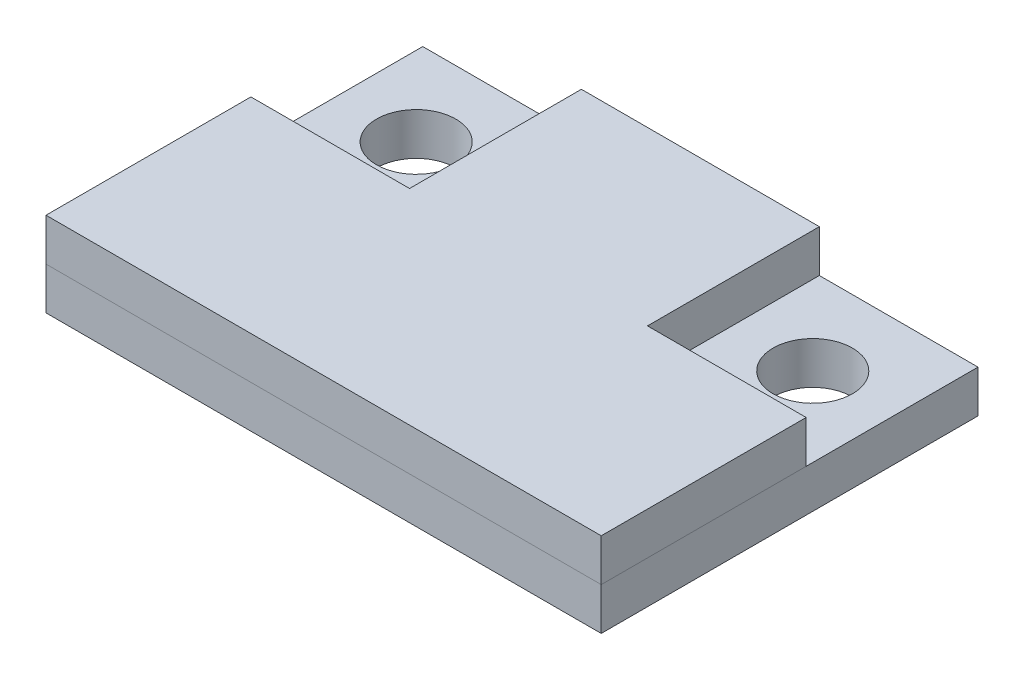
ISO-10303-21;
HEADER;
FILE_DESCRIPTION(('STEP AP214'),'2;1');
FILE_NAME('part.step','',(''),(''),'','','');
FILE_SCHEMA(('AUTOMOTIVE_DESIGN { 1 0 10303 214 1 1 1 1 }'));
ENDSEC;
DATA;
#1=APPLICATION_CONTEXT('core data for automotive mechanical design processes');
#2=APPLICATION_PROTOCOL_DEFINITION('international standard','automotive_design',2000,#1);
#3=PRODUCT_CONTEXT('',#1,'mechanical');
#4=PRODUCT('Part','Part','',(#3));
#5=PRODUCT_RELATED_PRODUCT_CATEGORY('part','',(#4));
#6=PRODUCT_DEFINITION_FORMATION('','',#4);
#7=PRODUCT_DEFINITION_CONTEXT('part definition',#1,'design');
#8=PRODUCT_DEFINITION('design','',#6,#7);
#9=PRODUCT_DEFINITION_SHAPE('','',#8);
#10=(LENGTH_UNIT() NAMED_UNIT(*) SI_UNIT(.MILLI.,.METRE.));
#11=(NAMED_UNIT(*) PLANE_ANGLE_UNIT() SI_UNIT($,.RADIAN.));
#12=(NAMED_UNIT(*) SI_UNIT($,.STERADIAN.) SOLID_ANGLE_UNIT());
#13=UNCERTAINTY_MEASURE_WITH_UNIT(LENGTH_MEASURE(1.E-05),#10,'distance_accuracy_value','');
#14=(GEOMETRIC_REPRESENTATION_CONTEXT(3) GLOBAL_UNCERTAINTY_ASSIGNED_CONTEXT((#13)) GLOBAL_UNIT_ASSIGNED_CONTEXT((#10,
#11,#12)) REPRESENTATION_CONTEXT('',''));
#15=CARTESIAN_POINT('',(0.,0.,0.));
#16=DIRECTION('',(0.,0.,1.));
#17=DIRECTION('',(1.,0.,0.));
#18=AXIS2_PLACEMENT_3D('',#15,#16,#17);
#19=CARTESIAN_POINT('',(-4.5,1.6,-7.125));
#20=DIRECTION('',(1.,0.,0.));
#21=DIRECTION('',(0.,0.,-1.));
#22=AXIS2_PLACEMENT_3D('',#19,#20,#21);
#23=PLANE('',#22);
#24=DIRECTION('',(0.,0.,1.));
#25=VECTOR('',#24,1.);
#26=CARTESIAN_POINT('',(-4.5,0.,-7.125));
#27=LINE('',#26,#25);
#28=CARTESIAN_POINT('',(-4.5,0.,-7.125));
#29=VERTEX_POINT('',#28);
#30=CARTESIAN_POINT('',(-4.5,0.,-0.624999999999993));
#31=VERTEX_POINT('',#30);
#32=EDGE_CURVE('E147',#29,#31,#27,.T.);
#33=ORIENTED_EDGE('',*,*,#32,.T.);
#34=DIRECTION('',(0.,-1.,0.));
#35=VECTOR('',#34,1.);
#36=CARTESIAN_POINT('',(-4.5,1.6,-0.624999999999993));
#37=LINE('',#36,#35);
#38=CARTESIAN_POINT('',(-4.5,1.6,-0.624999999999993));
#39=VERTEX_POINT('',#38);
#40=EDGE_CURVE('E12',#39,#31,#37,.T.);
#41=ORIENTED_EDGE('',*,*,#40,.F.);
#42=DIRECTION('',(0.,0.,1.));
#43=VECTOR('',#42,1.);
#44=CARTESIAN_POINT('',(-4.5,1.6,-7.125));
#45=LINE('',#44,#43);
#46=CARTESIAN_POINT('',(-4.5,1.6,-7.125));
#47=VERTEX_POINT('',#46);
#48=EDGE_CURVE('E161',#47,#39,#45,.T.);
#49=ORIENTED_EDGE('',*,*,#48,.F.);
#50=DIRECTION('',(0.,-1.,0.));
#51=VECTOR('',#50,1.);
#52=CARTESIAN_POINT('',(-4.5,1.6,-7.125));
#53=LINE('',#52,#51);
#54=EDGE_CURVE('E143',#47,#29,#53,.T.);
#55=ORIENTED_EDGE('',*,*,#54,.T.);
#56=EDGE_LOOP('',(#33,#41,#49,#55));
#57=FACE_BOUND('',#56,.T.);
#58=ADVANCED_FACE('F51',(#57),#23,.F.);
#59=CARTESIAN_POINT('',(-10.5,1.6,-0.624999999999993));
#60=DIRECTION('',(0.,0.,1.));
#61=DIRECTION('',(1.,0.,0.));
#62=AXIS2_PLACEMENT_3D('',#59,#60,#61);
#63=PLANE('',#62);
#64=DIRECTION('',(-1.,0.,0.));
#65=VECTOR('',#64,1.);
#66=CARTESIAN_POINT('',(-10.5,0.,-0.624999999999993));
#67=LINE('',#66,#65);
#68=CARTESIAN_POINT('',(-10.5,0.,-0.624999999999993));
#69=VERTEX_POINT('',#68);
#70=EDGE_CURVE('E150',#31,#69,#67,.T.);
#71=ORIENTED_EDGE('',*,*,#70,.T.);
#72=DIRECTION('',(0.,-1.,0.));
#73=VECTOR('',#72,1.);
#74=CARTESIAN_POINT('',(-10.5,1.6,-0.624999999999993));
#75=LINE('',#74,#73);
#76=CARTESIAN_POINT('',(-10.5,1.6,-0.624999999999993));
#77=VERTEX_POINT('',#76);
#78=EDGE_CURVE('E59',#77,#69,#75,.T.);
#79=ORIENTED_EDGE('',*,*,#78,.F.);
#80=DIRECTION('',(-1.,0.,0.));
#81=VECTOR('',#80,1.);
#82=CARTESIAN_POINT('',(-10.5,1.6,-0.624999999999993));
#83=LINE('',#82,#81);
#84=EDGE_CURVE('E110',#39,#77,#83,.T.);
#85=ORIENTED_EDGE('',*,*,#84,.F.);
#86=ORIENTED_EDGE('',*,*,#40,.T.);
#87=EDGE_LOOP('',(#71,#79,#85,#86));
#88=FACE_BOUND('',#87,.T.);
#89=ADVANCED_FACE('F196',(#88),#63,.F.);
#90=CARTESIAN_POINT('',(-10.5,1.6,-0.624999999999993));
#91=DIRECTION('',(1.,0.,0.));
#92=DIRECTION('',(0.,0.,-1.));
#93=AXIS2_PLACEMENT_3D('',#90,#91,#92);
#94=PLANE('',#93);
#95=DIRECTION('',(0.,0.,1.));
#96=VECTOR('',#95,1.);
#97=CARTESIAN_POINT('',(-10.5,0.,-0.624999999999993));
#98=LINE('',#97,#96);
#99=CARTESIAN_POINT('',(-10.5,0.,7.125));
#100=VERTEX_POINT('',#99);
#101=EDGE_CURVE('E152',#69,#100,#98,.T.);
#102=ORIENTED_EDGE('',*,*,#101,.T.);
#103=DIRECTION('',(0.,-1.,0.));
#104=VECTOR('',#103,1.);
#105=CARTESIAN_POINT('',(-10.5,1.6,7.125));
#106=LINE('',#105,#104);
#107=CARTESIAN_POINT('',(-10.5,1.6,7.125));
#108=VERTEX_POINT('',#107);
#109=EDGE_CURVE('E168',#108,#100,#106,.T.);
#110=ORIENTED_EDGE('',*,*,#109,.F.);
#111=DIRECTION('',(0.,0.,1.));
#112=VECTOR('',#111,1.);
#113=CARTESIAN_POINT('',(-10.5,1.6,-0.624999999999993));
#114=LINE('',#113,#112);
#115=EDGE_CURVE('E176',#77,#108,#114,.T.);
#116=ORIENTED_EDGE('',*,*,#115,.F.);
#117=ORIENTED_EDGE('',*,*,#78,.T.);
#118=EDGE_LOOP('',(#102,#110,#116,#117));
#119=FACE_BOUND('',#118,.T.);
#120=ADVANCED_FACE('F174',(#119),#94,.F.);
#121=CARTESIAN_POINT('',(-10.5,1.6,7.125));
#122=DIRECTION('',(0.,0.,-1.));
#123=DIRECTION('',(-1.,0.,0.));
#124=AXIS2_PLACEMENT_3D('',#121,#122,#123);
#125=PLANE('',#124);
#126=DIRECTION('',(1.,0.,0.));
#127=VECTOR('',#126,1.);
#128=CARTESIAN_POINT('',(-10.5,0.,7.125));
#129=LINE('',#128,#127);
#130=CARTESIAN_POINT('',(10.5,0.,7.125));
#131=VERTEX_POINT('',#130);
#132=EDGE_CURVE('E154',#100,#131,#129,.T.);
#133=ORIENTED_EDGE('',*,*,#132,.T.);
#134=DIRECTION('',(0.,-1.,0.));
#135=VECTOR('',#134,1.);
#136=CARTESIAN_POINT('',(10.5,1.6,7.125));
#137=LINE('',#136,#135);
#138=CARTESIAN_POINT('',(10.5,1.6,7.125));
#139=VERTEX_POINT('',#138);
#140=EDGE_CURVE('E165',#139,#131,#137,.T.);
#141=ORIENTED_EDGE('',*,*,#140,.F.);
#142=DIRECTION('',(1.,0.,0.));
#143=VECTOR('',#142,1.);
#144=CARTESIAN_POINT('',(-10.5,1.6,7.125));
#145=LINE('',#144,#143);
#146=EDGE_CURVE('E188',#108,#139,#145,.T.);
#147=ORIENTED_EDGE('',*,*,#146,.F.);
#148=ORIENTED_EDGE('',*,*,#109,.T.);
#149=EDGE_LOOP('',(#133,#141,#147,#148));
#150=FACE_BOUND('',#149,.T.);
#151=ADVANCED_FACE('F184',(#150),#125,.F.);
#152=CARTESIAN_POINT('',(10.5,1.6,7.125));
#153=DIRECTION('',(-1.,0.,0.));
#154=DIRECTION('',(0.,0.,1.));
#155=AXIS2_PLACEMENT_3D('',#152,#153,#154);
#156=PLANE('',#155);
#157=DIRECTION('',(0.,0.,-1.));
#158=VECTOR('',#157,1.);
#159=CARTESIAN_POINT('',(10.5,0.,7.125));
#160=LINE('',#159,#158);
#161=CARTESIAN_POINT('',(10.5,0.,-0.624999999999992));
#162=VERTEX_POINT('',#161);
#163=EDGE_CURVE('E156',#131,#162,#160,.T.);
#164=ORIENTED_EDGE('',*,*,#163,.T.);
#165=DIRECTION('',(0.,-1.,0.));
#166=VECTOR('',#165,1.);
#167=CARTESIAN_POINT('',(10.5,1.6,-0.624999999999992));
#168=LINE('',#167,#166);
#169=CARTESIAN_POINT('',(10.5,1.6,-0.624999999999992));
#170=VERTEX_POINT('',#169);
#171=EDGE_CURVE('E138',#170,#162,#168,.T.);
#172=ORIENTED_EDGE('',*,*,#171,.F.);
#173=DIRECTION('',(0.,0.,-1.));
#174=VECTOR('',#173,1.);
#175=CARTESIAN_POINT('',(10.5,1.6,7.125));
#176=LINE('',#175,#174);
#177=EDGE_CURVE('E129',#139,#170,#176,.T.);
#178=ORIENTED_EDGE('',*,*,#177,.F.);
#179=ORIENTED_EDGE('',*,*,#140,.T.);
#180=EDGE_LOOP('',(#164,#172,#178,#179));
#181=FACE_BOUND('',#180,.T.);
#182=ADVANCED_FACE('F187',(#181),#156,.F.);
#183=CARTESIAN_POINT('',(10.5,1.6,-0.624999999999992));
#184=DIRECTION('',(0.,0.,1.));
#185=DIRECTION('',(1.,0.,0.));
#186=AXIS2_PLACEMENT_3D('',#183,#184,#185);
#187=PLANE('',#186);
#188=DIRECTION('',(-1.,0.,0.));
#189=VECTOR('',#188,1.);
#190=CARTESIAN_POINT('',(10.5,0.,-0.624999999999992));
#191=LINE('',#190,#189);
#192=CARTESIAN_POINT('',(4.5,0.,-0.624999999999992));
#193=VERTEX_POINT('',#192);
#194=EDGE_CURVE('E137',#162,#193,#191,.T.);
#195=ORIENTED_EDGE('',*,*,#194,.T.);
#196=DIRECTION('',(0.,-1.,0.));
#197=VECTOR('',#196,1.);
#198=CARTESIAN_POINT('',(4.5,1.6,-0.624999999999992));
#199=LINE('',#198,#197);
#200=CARTESIAN_POINT('',(4.5,1.6,-0.624999999999992));
#201=VERTEX_POINT('',#200);
#202=EDGE_CURVE('E134',#201,#193,#199,.T.);
#203=ORIENTED_EDGE('',*,*,#202,.F.);
#204=DIRECTION('',(-1.,0.,0.));
#205=VECTOR('',#204,1.);
#206=CARTESIAN_POINT('',(10.5,1.6,-0.624999999999992));
#207=LINE('',#206,#205);
#208=EDGE_CURVE('E123',#170,#201,#207,.T.);
#209=ORIENTED_EDGE('',*,*,#208,.F.);
#210=ORIENTED_EDGE('',*,*,#171,.T.);
#211=EDGE_LOOP('',(#195,#203,#209,#210));
#212=FACE_BOUND('',#211,.T.);
#213=ADVANCED_FACE('F135',(#212),#187,.F.);
#214=CARTESIAN_POINT('',(4.5,1.6,-7.125));
#215=DIRECTION('',(-1.,0.,0.));
#216=DIRECTION('',(0.,0.,1.));
#217=AXIS2_PLACEMENT_3D('',#214,#215,#216);
#218=PLANE('',#217);
#219=DIRECTION('',(0.,0.,-1.));
#220=VECTOR('',#219,1.);
#221=CARTESIAN_POINT('',(4.5,0.,-7.125));
#222=LINE('',#221,#220);
#223=CARTESIAN_POINT('',(4.5,0.,-7.125));
#224=VERTEX_POINT('',#223);
#225=EDGE_CURVE('E96',#193,#224,#222,.T.);
#226=ORIENTED_EDGE('',*,*,#225,.T.);
#227=DIRECTION('',(0.,-1.,0.));
#228=VECTOR('',#227,1.);
#229=CARTESIAN_POINT('',(4.5,1.6,-7.125));
#230=LINE('',#229,#228);
#231=CARTESIAN_POINT('',(4.5,1.6,-7.125));
#232=VERTEX_POINT('',#231);
#233=EDGE_CURVE('E139',#232,#224,#230,.T.);
#234=ORIENTED_EDGE('',*,*,#233,.F.);
#235=DIRECTION('',(0.,0.,-1.));
#236=VECTOR('',#235,1.);
#237=CARTESIAN_POINT('',(4.5,1.6,-7.125));
#238=LINE('',#237,#236);
#239=EDGE_CURVE('E127',#201,#232,#238,.T.);
#240=ORIENTED_EDGE('',*,*,#239,.F.);
#241=ORIENTED_EDGE('',*,*,#202,.T.);
#242=EDGE_LOOP('',(#226,#234,#240,#241));
#243=FACE_BOUND('',#242,.T.);
#244=ADVANCED_FACE('F141',(#243),#218,.F.);
#245=CARTESIAN_POINT('',(4.5,1.6,-7.125));
#246=DIRECTION('',(0.,0.,1.));
#247=DIRECTION('',(1.,0.,0.));
#248=AXIS2_PLACEMENT_3D('',#245,#246,#247);
#249=PLANE('',#248);
#250=DIRECTION('',(-1.,0.,0.));
#251=VECTOR('',#250,1.);
#252=CARTESIAN_POINT('',(4.5,0.,-7.125));
#253=LINE('',#252,#251);
#254=EDGE_CURVE('E102',#224,#29,#253,.T.);
#255=ORIENTED_EDGE('',*,*,#254,.T.);
#256=ORIENTED_EDGE('',*,*,#54,.F.);
#257=DIRECTION('',(-1.,0.,0.));
#258=VECTOR('',#257,1.);
#259=CARTESIAN_POINT('',(4.5,1.6,-7.125));
#260=LINE('',#259,#258);
#261=EDGE_CURVE('E67',#232,#47,#260,.T.);
#262=ORIENTED_EDGE('',*,*,#261,.F.);
#263=ORIENTED_EDGE('',*,*,#233,.T.);
#264=EDGE_LOOP('',(#255,#256,#262,#263));
#265=FACE_BOUND('',#264,.T.);
#266=ADVANCED_FACE('F212',(#265),#249,.F.);
#267=CARTESIAN_POINT('',(0.,1.6,0.));
#268=DIRECTION('',(0.,1.,0.));
#269=DIRECTION('',(0.,0.,1.));
#270=AXIS2_PLACEMENT_3D('',#267,#268,#269);
#271=PLANE('',#270);
#272=ORIENTED_EDGE('',*,*,#48,.T.);
#273=ORIENTED_EDGE('',*,*,#84,.T.);
#274=ORIENTED_EDGE('',*,*,#115,.T.);
#275=ORIENTED_EDGE('',*,*,#146,.T.);
#276=ORIENTED_EDGE('',*,*,#177,.T.);
#277=ORIENTED_EDGE('',*,*,#208,.T.);
#278=ORIENTED_EDGE('',*,*,#239,.T.);
#279=ORIENTED_EDGE('',*,*,#261,.T.);
#280=EDGE_LOOP('',(#272,#273,#274,#275,#276,#277,#278,#279));
#281=FACE_BOUND('',#280,.T.);
#282=ADVANCED_FACE('F125',(#281),#271,.T.);
#283=CARTESIAN_POINT('',(0.,0.,0.));
#284=DIRECTION('',(0.,1.,0.));
#285=DIRECTION('',(0.,0.,1.));
#286=AXIS2_PLACEMENT_3D('',#283,#284,#285);
#287=PLANE('',#286);
#288=ORIENTED_EDGE('',*,*,#32,.F.);
#289=ORIENTED_EDGE('',*,*,#254,.F.);
#290=ORIENTED_EDGE('',*,*,#225,.F.);
#291=ORIENTED_EDGE('',*,*,#194,.F.);
#292=ORIENTED_EDGE('',*,*,#163,.F.);
#293=ORIENTED_EDGE('',*,*,#132,.F.);
#294=ORIENTED_EDGE('',*,*,#101,.F.);
#295=ORIENTED_EDGE('',*,*,#70,.F.);
#296=EDGE_LOOP('',(#288,#289,#290,#291,#292,#293,#294,#295));
#297=FACE_BOUND('',#296,.T.);
#298=ADVANCED_FACE('F180',(#297),#287,.F.);
#299=CLOSED_SHELL('',(#58,#89,#120,#151,#182,#213,#244,#266,#282,#298));
#300=MANIFOLD_SOLID_BREP('B2',#299);
#301=CARTESIAN_POINT('',(10.5,-1.6,7.125));
#302=DIRECTION('',(1.,0.,0.));
#303=DIRECTION('',(0.,0.,-1.));
#304=AXIS2_PLACEMENT_3D('',#301,#302,#303);
#305=PLANE('',#304);
#306=DIRECTION('',(0.,0.,-1.));
#307=VECTOR('',#306,1.);
#308=CARTESIAN_POINT('',(10.5,0.,7.125));
#309=LINE('',#308,#307);
#310=CARTESIAN_POINT('',(10.5,0.,7.125));
#311=VERTEX_POINT('',#310);
#312=CARTESIAN_POINT('',(10.5,0.,-7.125));
#313=VERTEX_POINT('',#312);
#314=EDGE_CURVE('E344',#311,#313,#309,.T.);
#315=ORIENTED_EDGE('',*,*,#314,.F.);
#316=DIRECTION('',(0.,1.,0.));
#317=VECTOR('',#316,1.);
#318=CARTESIAN_POINT('',(10.5,-1.6,7.125));
#319=LINE('',#318,#317);
#320=CARTESIAN_POINT('',(10.5,-1.6,7.125));
#321=VERTEX_POINT('',#320);
#322=EDGE_CURVE('E49',#321,#311,#319,.T.);
#323=ORIENTED_EDGE('',*,*,#322,.F.);
#324=DIRECTION('',(0.,0.,-1.));
#325=VECTOR('',#324,1.);
#326=CARTESIAN_POINT('',(10.5,-1.6,7.125));
#327=LINE('',#326,#325);
#328=CARTESIAN_POINT('',(10.5,-1.6,-7.125));
#329=VERTEX_POINT('',#328);
#330=EDGE_CURVE('E337',#321,#329,#327,.T.);
#331=ORIENTED_EDGE('',*,*,#330,.T.);
#332=DIRECTION('',(0.,1.,0.));
#333=VECTOR('',#332,1.);
#334=CARTESIAN_POINT('',(10.5,-1.6,-7.125));
#335=LINE('',#334,#333);
#336=EDGE_CURVE('E282',#329,#313,#335,.T.);
#337=ORIENTED_EDGE('',*,*,#336,.T.);
#338=EDGE_LOOP('',(#315,#323,#331,#337));
#339=FACE_BOUND('',#338,.T.);
#340=ADVANCED_FACE('F279',(#339),#305,.T.);
#341=CARTESIAN_POINT('',(-10.5,-1.6,7.125));
#342=DIRECTION('',(0.,0.,1.));
#343=DIRECTION('',(1.,0.,0.));
#344=AXIS2_PLACEMENT_3D('',#341,#342,#343);
#345=PLANE('',#344);
#346=DIRECTION('',(1.,0.,0.));
#347=VECTOR('',#346,1.);
#348=CARTESIAN_POINT('',(-10.5,0.,7.125));
#349=LINE('',#348,#347);
#350=CARTESIAN_POINT('',(-10.5,0.,7.125));
#351=VERTEX_POINT('',#350);
#352=EDGE_CURVE('E339',#351,#311,#349,.T.);
#353=ORIENTED_EDGE('',*,*,#352,.F.);
#354=DIRECTION('',(0.,1.,0.));
#355=VECTOR('',#354,1.);
#356=CARTESIAN_POINT('',(-10.5,-1.6,7.125));
#357=LINE('',#356,#355);
#358=CARTESIAN_POINT('',(-10.5,-1.6,7.125));
#359=VERTEX_POINT('',#358);
#360=EDGE_CURVE('E288',#359,#351,#357,.T.);
#361=ORIENTED_EDGE('',*,*,#360,.F.);
#362=DIRECTION('',(1.,0.,0.));
#363=VECTOR('',#362,1.);
#364=CARTESIAN_POINT('',(-10.5,-1.6,7.125));
#365=LINE('',#364,#363);
#366=EDGE_CURVE('E334',#359,#321,#365,.T.);
#367=ORIENTED_EDGE('',*,*,#366,.T.);
#368=ORIENTED_EDGE('',*,*,#322,.T.);
#369=EDGE_LOOP('',(#353,#361,#367,#368));
#370=FACE_BOUND('',#369,.T.);
#371=ADVANCED_FACE('F355',(#370),#345,.T.);
#372=CARTESIAN_POINT('',(-10.5,-1.6,7.125));
#373=DIRECTION('',(-1.,0.,0.));
#374=DIRECTION('',(0.,0.,1.));
#375=AXIS2_PLACEMENT_3D('',#372,#373,#374);
#376=PLANE('',#375);
#377=DIRECTION('',(0.,0.,1.));
#378=VECTOR('',#377,1.);
#379=CARTESIAN_POINT('',(-10.5,0.,7.125));
#380=LINE('',#379,#378);
#381=CARTESIAN_POINT('',(-10.5,0.,-7.125));
#382=VERTEX_POINT('',#381);
#383=EDGE_CURVE('E329',#382,#351,#380,.T.);
#384=ORIENTED_EDGE('',*,*,#383,.F.);
#385=DIRECTION('',(0.,1.,0.));
#386=VECTOR('',#385,1.);
#387=CARTESIAN_POINT('',(-10.5,-1.6,-7.125));
#388=LINE('',#387,#386);
#389=CARTESIAN_POINT('',(-10.5,-1.6,-7.125));
#390=VERTEX_POINT('',#389);
#391=EDGE_CURVE('E324',#390,#382,#388,.T.);
#392=ORIENTED_EDGE('',*,*,#391,.F.);
#393=DIRECTION('',(0.,0.,1.));
#394=VECTOR('',#393,1.);
#395=CARTESIAN_POINT('',(-10.5,-1.6,7.125));
#396=LINE('',#395,#394);
#397=EDGE_CURVE('E327',#390,#359,#396,.T.);
#398=ORIENTED_EDGE('',*,*,#397,.T.);
#399=ORIENTED_EDGE('',*,*,#360,.T.);
#400=EDGE_LOOP('',(#384,#392,#398,#399));
#401=FACE_BOUND('',#400,.T.);
#402=ADVANCED_FACE('F326',(#401),#376,.T.);
#403=CARTESIAN_POINT('',(-10.5,-1.6,-7.125));
#404=DIRECTION('',(0.,0.,-1.));
#405=DIRECTION('',(-1.,0.,0.));
#406=AXIS2_PLACEMENT_3D('',#403,#404,#405);
#407=PLANE('',#406);
#408=DIRECTION('',(-1.,0.,0.));
#409=VECTOR('',#408,1.);
#410=CARTESIAN_POINT('',(-10.5,0.,-7.125));
#411=LINE('',#410,#409);
#412=EDGE_CURVE('E347',#313,#382,#411,.T.);
#413=ORIENTED_EDGE('',*,*,#412,.F.);
#414=ORIENTED_EDGE('',*,*,#336,.F.);
#415=DIRECTION('',(-1.,0.,0.));
#416=VECTOR('',#415,1.);
#417=CARTESIAN_POINT('',(-10.5,-1.6,-7.125));
#418=LINE('',#417,#416);
#419=EDGE_CURVE('E333',#329,#390,#418,.T.);
#420=ORIENTED_EDGE('',*,*,#419,.T.);
#421=ORIENTED_EDGE('',*,*,#391,.T.);
#422=EDGE_LOOP('',(#413,#414,#420,#421));
#423=FACE_BOUND('',#422,.T.);
#424=ADVANCED_FACE('F336',(#423),#407,.T.);
#425=CARTESIAN_POINT('',(0.,-1.6,0.));
#426=DIRECTION('',(0.,-1.,0.));
#427=DIRECTION('',(0.,0.,-1.));
#428=AXIS2_PLACEMENT_3D('',#425,#426,#427);
#429=PLANE('',#428);
#430=CARTESIAN_POINT('',(7.5,-1.6,-3.875));
#431=DIRECTION('',(0.,1.,0.));
#432=DIRECTION('',(0.,0.,1.));
#433=AXIS2_PLACEMENT_3D('',#430,#431,#432);
#434=CIRCLE('',#433,1.5);
#435=CARTESIAN_POINT('',(7.5,-1.6,-2.375));
#436=VERTEX_POINT('',#435);
#437=EDGE_CURVE('E388',#436,#436,#434,.T.);
#438=ORIENTED_EDGE('',*,*,#437,.T.);
#439=EDGE_LOOP('',(#438));
#440=FACE_BOUND('',#439,.T.);
#441=CARTESIAN_POINT('',(-7.5,-1.6,-3.875));
#442=DIRECTION('',(0.,1.,0.));
#443=DIRECTION('',(0.,0.,1.));
#444=AXIS2_PLACEMENT_3D('',#441,#442,#443);
#445=CIRCLE('',#444,1.5);
#446=CARTESIAN_POINT('',(-7.5,-1.6,-2.375));
#447=VERTEX_POINT('',#446);
#448=EDGE_CURVE('E348',#447,#447,#445,.T.);
#449=ORIENTED_EDGE('',*,*,#448,.T.);
#450=EDGE_LOOP('',(#449));
#451=FACE_BOUND('',#450,.T.);
#452=ORIENTED_EDGE('',*,*,#330,.F.);
#453=ORIENTED_EDGE('',*,*,#366,.F.);
#454=ORIENTED_EDGE('',*,*,#397,.F.);
#455=ORIENTED_EDGE('',*,*,#419,.F.);
#456=EDGE_LOOP('',(#452,#453,#454,#455));
#457=FACE_BOUND('',#456,.T.);
#458=ADVANCED_FACE('F332',(#440,#451,#457),#429,.T.);
#459=CARTESIAN_POINT('',(0.,0.,0.));
#460=DIRECTION('',(0.,-1.,0.));
#461=DIRECTION('',(0.,0.,-1.));
#462=AXIS2_PLACEMENT_3D('',#459,#460,#461);
#463=PLANE('',#462);
#464=CARTESIAN_POINT('',(7.5,0.,-3.875));
#465=DIRECTION('',(0.,1.,0.));
#466=DIRECTION('',(0.,0.,1.));
#467=AXIS2_PLACEMENT_3D('',#464,#465,#466);
#468=CIRCLE('',#467,1.5);
#469=CARTESIAN_POINT('',(7.5,0.,-2.375));
#470=VERTEX_POINT('',#469);
#471=EDGE_CURVE('E391',#470,#470,#468,.T.);
#472=ORIENTED_EDGE('',*,*,#471,.F.);
#473=EDGE_LOOP('',(#472));
#474=FACE_BOUND('',#473,.T.);
#475=CARTESIAN_POINT('',(-7.5,0.,-3.875));
#476=DIRECTION('',(0.,1.,0.));
#477=DIRECTION('',(0.,0.,1.));
#478=AXIS2_PLACEMENT_3D('',#475,#476,#477);
#479=CIRCLE('',#478,1.5);
#480=CARTESIAN_POINT('',(-7.5,0.,-2.375));
#481=VERTEX_POINT('',#480);
#482=EDGE_CURVE('E393',#481,#481,#479,.T.);
#483=ORIENTED_EDGE('',*,*,#482,.F.);
#484=EDGE_LOOP('',(#483));
#485=FACE_BOUND('',#484,.T.);
#486=ORIENTED_EDGE('',*,*,#314,.T.);
#487=ORIENTED_EDGE('',*,*,#412,.T.);
#488=ORIENTED_EDGE('',*,*,#383,.T.);
#489=ORIENTED_EDGE('',*,*,#352,.T.);
#490=EDGE_LOOP('',(#486,#487,#488,#489));
#491=FACE_BOUND('',#490,.T.);
#492=ADVANCED_FACE('F354',(#474,#485,#491),#463,.F.);
#493=CARTESIAN_POINT('',(-7.5,-1.6,-3.875));
#494=DIRECTION('',(0.,1.,0.));
#495=DIRECTION('',(0.,0.,1.));
#496=AXIS2_PLACEMENT_3D('',#493,#494,#495);
#497=CYLINDRICAL_SURFACE('',#496,1.5);
#498=ORIENTED_EDGE('',*,*,#448,.F.);
#499=EDGE_LOOP('',(#498));
#500=FACE_BOUND('',#499,.T.);
#501=ORIENTED_EDGE('',*,*,#482,.T.);
#502=EDGE_LOOP('',(#501));
#503=FACE_BOUND('',#502,.T.);
#504=ADVANCED_FACE('F373',(#500,#503),#497,.F.);
#505=CARTESIAN_POINT('',(7.5,-1.6,-3.875));
#506=DIRECTION('',(0.,1.,0.));
#507=DIRECTION('',(0.,0.,1.));
#508=AXIS2_PLACEMENT_3D('',#505,#506,#507);
#509=CYLINDRICAL_SURFACE('',#508,1.5);
#510=ORIENTED_EDGE('',*,*,#437,.F.);
#511=EDGE_LOOP('',(#510));
#512=FACE_BOUND('',#511,.T.);
#513=ORIENTED_EDGE('',*,*,#471,.T.);
#514=EDGE_LOOP('',(#513));
#515=FACE_BOUND('',#514,.T.);
#516=ADVANCED_FACE('F380',(#512,#515),#509,.F.);
#517=CLOSED_SHELL('',(#340,#371,#402,#424,#458,#492,#504,#516));
#518=MANIFOLD_SOLID_BREP('B6',#517);
#519=ADVANCED_BREP_SHAPE_REPRESENTATION('',(#18,#300,#518),#14);
#520=SHAPE_DEFINITION_REPRESENTATION(#9,#519);
ENDSEC;
END-ISO-10303-21;
